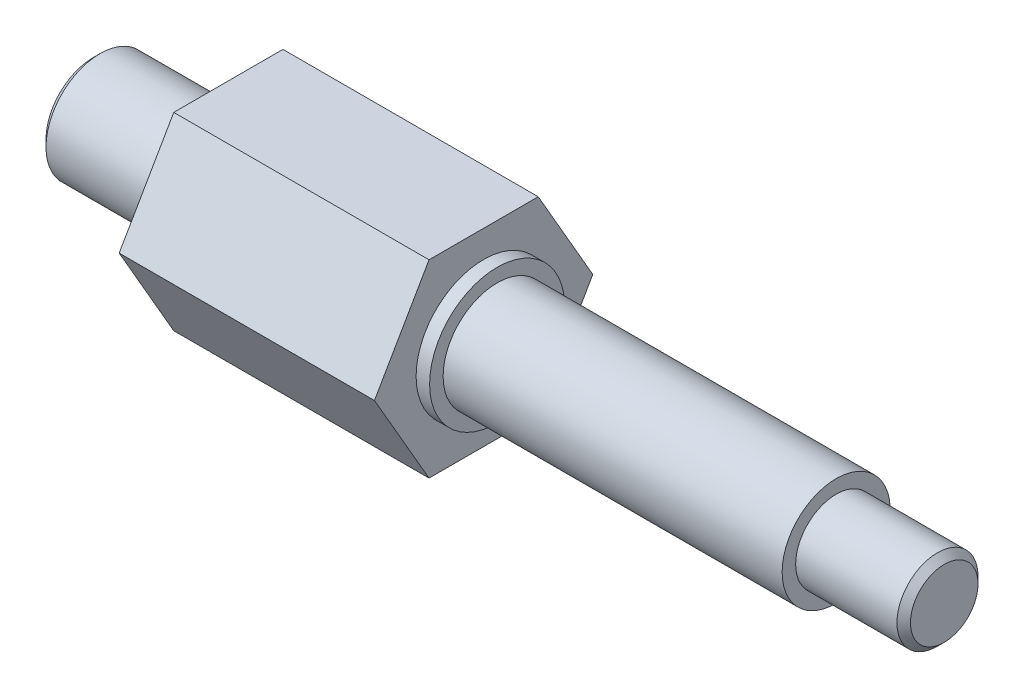
ISO-10303-21;
HEADER;
FILE_DESCRIPTION(('STEP AP214'),'2;1');
FILE_NAME('part.step','',(''),(''),'','','');
FILE_SCHEMA(('AUTOMOTIVE_DESIGN { 1 0 10303 214 1 1 1 1 }'));
ENDSEC;
DATA;
#1=APPLICATION_CONTEXT('core data for automotive mechanical design processes');
#2=APPLICATION_PROTOCOL_DEFINITION('international standard','automotive_design',2000,#1);
#3=PRODUCT_CONTEXT('',#1,'mechanical');
#4=PRODUCT('Part','Part','',(#3));
#5=PRODUCT_RELATED_PRODUCT_CATEGORY('part','',(#4));
#6=PRODUCT_DEFINITION_FORMATION('','',#4);
#7=PRODUCT_DEFINITION_CONTEXT('part definition',#1,'design');
#8=PRODUCT_DEFINITION('design','',#6,#7);
#9=PRODUCT_DEFINITION_SHAPE('','',#8);
#10=(LENGTH_UNIT() NAMED_UNIT(*) SI_UNIT(.MILLI.,.METRE.));
#11=(NAMED_UNIT(*) PLANE_ANGLE_UNIT() SI_UNIT($,.RADIAN.));
#12=(NAMED_UNIT(*) SI_UNIT($,.STERADIAN.) SOLID_ANGLE_UNIT());
#13=UNCERTAINTY_MEASURE_WITH_UNIT(LENGTH_MEASURE(1.E-05),#10,'distance_accuracy_value','');
#14=(GEOMETRIC_REPRESENTATION_CONTEXT(3) GLOBAL_UNCERTAINTY_ASSIGNED_CONTEXT((#13)) GLOBAL_UNIT_ASSIGNED_CONTEXT((#10,
#11,#12)) REPRESENTATION_CONTEXT('',''));
#15=CARTESIAN_POINT('',(0.,0.,0.));
#16=DIRECTION('',(0.,0.,1.));
#17=DIRECTION('',(1.,0.,0.));
#18=AXIS2_PLACEMENT_3D('',#15,#16,#17);
#19=CARTESIAN_POINT('',(53.,6.99999673624924,4.04145));
#20=DIRECTION('',(0.,-0.5,-0.866025403784439));
#21=DIRECTION('',(0.,0.866025403784439,-0.5));
#22=AXIS2_PLACEMENT_3D('',#19,#20,#21);
#23=PLANE('',#22);
#24=DIRECTION('',(0.,-0.866025403784439,0.5));
#25=VECTOR('',#24,1.);
#26=CARTESIAN_POINT('',(18.9,6.99999673624924,4.04145));
#27=LINE('',#26,#25);
#28=CARTESIAN_POINT('',(18.9,6.99999673624924,4.04145000000001));
#29=VERTEX_POINT('',#28);
#30=CARTESIAN_POINT('',(18.9,0.,8.08290000000001));
#31=VERTEX_POINT('',#30);
#32=EDGE_CURVE('E88',#29,#31,#27,.T.);
#33=ORIENTED_EDGE('',*,*,#32,.F.);
#34=DIRECTION('',(-1.,0.,0.));
#35=VECTOR('',#34,1.);
#36=CARTESIAN_POINT('',(53.,6.99999673624924,4.04145));
#37=LINE('',#36,#35);
#38=CARTESIAN_POINT('',(0.,6.99999673624924,4.04145));
#39=VERTEX_POINT('',#38);
#40=EDGE_CURVE('E59',#29,#39,#37,.T.);
#41=ORIENTED_EDGE('',*,*,#40,.T.);
#42=DIRECTION('',(0.,0.866025403784439,-0.5));
#43=VECTOR('',#42,1.);
#44=CARTESIAN_POINT('',(0.,6.99999673624924,4.04145));
#45=LINE('',#44,#43);
#46=CARTESIAN_POINT('',(0.,0.,8.08290000000001));
#47=VERTEX_POINT('',#46);
#48=EDGE_CURVE('E106',#47,#39,#45,.T.);
#49=ORIENTED_EDGE('',*,*,#48,.F.);
#50=DIRECTION('',(-1.,0.,0.));
#51=VECTOR('',#50,1.);
#52=CARTESIAN_POINT('',(53.,0.,8.08290000000001));
#53=LINE('',#52,#51);
#54=EDGE_CURVE('E101',#31,#47,#53,.T.);
#55=ORIENTED_EDGE('',*,*,#54,.F.);
#56=EDGE_LOOP('',(#33,#41,#49,#55));
#57=FACE_BOUND('',#56,.T.);
#58=ADVANCED_FACE('F36',(#57),#23,.F.);
#59=CARTESIAN_POINT('',(53.,0.,8.08290000000001));
#60=DIRECTION('',(0.,0.5,-0.866025403784439));
#61=DIRECTION('',(0.,0.866025403784439,0.5));
#62=AXIS2_PLACEMENT_3D('',#59,#60,#61);
#63=PLANE('',#62);
#64=DIRECTION('',(0.,-0.866025403784439,-0.5));
#65=VECTOR('',#64,1.);
#66=CARTESIAN_POINT('',(18.9,0.,8.08290000000001));
#67=LINE('',#66,#65);
#68=CARTESIAN_POINT('',(18.9,-6.99999673624924,4.04145000000001));
#69=VERTEX_POINT('',#68);
#70=EDGE_CURVE('E91',#31,#69,#67,.T.);
#71=ORIENTED_EDGE('',*,*,#70,.F.);
#72=ORIENTED_EDGE('',*,*,#54,.T.);
#73=DIRECTION('',(0.,0.866025403784439,0.5));
#74=VECTOR('',#73,1.);
#75=CARTESIAN_POINT('',(0.,0.,8.08290000000001));
#76=LINE('',#75,#74);
#77=CARTESIAN_POINT('',(0.,-6.99999673624924,4.04145000000001));
#78=VERTEX_POINT('',#77);
#79=EDGE_CURVE('E243',#78,#47,#76,.T.);
#80=ORIENTED_EDGE('',*,*,#79,.F.);
#81=DIRECTION('',(-1.,0.,0.));
#82=VECTOR('',#81,1.);
#83=CARTESIAN_POINT('',(53.,-6.99999673624924,4.04145));
#84=LINE('',#83,#82);
#85=EDGE_CURVE('E103',#69,#78,#84,.T.);
#86=ORIENTED_EDGE('',*,*,#85,.F.);
#87=EDGE_LOOP('',(#71,#72,#80,#86));
#88=FACE_BOUND('',#87,.T.);
#89=ADVANCED_FACE('F99',(#88),#63,.F.);
#90=CARTESIAN_POINT('',(53.,-6.99999673624924,4.04145));
#91=DIRECTION('',(0.,1.,0.));
#92=DIRECTION('',(0.,0.,1.));
#93=AXIS2_PLACEMENT_3D('',#90,#91,#92);
#94=PLANE('',#93);
#95=DIRECTION('',(0.,0.,-1.));
#96=VECTOR('',#95,1.);
#97=CARTESIAN_POINT('',(18.9,-6.99999673624924,4.04145));
#98=LINE('',#97,#96);
#99=CARTESIAN_POINT('',(18.9,-6.99999673624925,-4.04145));
#100=VERTEX_POINT('',#99);
#101=EDGE_CURVE('E104',#69,#100,#98,.T.);
#102=ORIENTED_EDGE('',*,*,#101,.F.);
#103=ORIENTED_EDGE('',*,*,#85,.T.);
#104=DIRECTION('',(0.,0.,1.));
#105=VECTOR('',#104,1.);
#106=CARTESIAN_POINT('',(0.,-6.99999673624924,4.04145));
#107=LINE('',#106,#105);
#108=CARTESIAN_POINT('',(0.,-6.99999673624925,-4.04145));
#109=VERTEX_POINT('',#108);
#110=EDGE_CURVE('E240',#109,#78,#107,.T.);
#111=ORIENTED_EDGE('',*,*,#110,.F.);
#112=DIRECTION('',(-1.,0.,0.));
#113=VECTOR('',#112,1.);
#114=CARTESIAN_POINT('',(53.,-6.99999673624924,-4.04145000000001));
#115=LINE('',#114,#113);
#116=EDGE_CURVE('E111',#100,#109,#115,.T.);
#117=ORIENTED_EDGE('',*,*,#116,.F.);
#118=EDGE_LOOP('',(#102,#103,#111,#117));
#119=FACE_BOUND('',#118,.T.);
#120=ADVANCED_FACE('F141',(#119),#94,.F.);
#121=CARTESIAN_POINT('',(53.,-6.99999673624924,-4.04145000000001));
#122=DIRECTION('',(0.,0.5,0.866025403784439));
#123=DIRECTION('',(0.,-0.866025403784439,0.5));
#124=AXIS2_PLACEMENT_3D('',#121,#122,#123);
#125=PLANE('',#124);
#126=DIRECTION('',(0.,0.866025403784439,-0.5));
#127=VECTOR('',#126,1.);
#128=CARTESIAN_POINT('',(18.9,-6.99999673624924,-4.04145000000001));
#129=LINE('',#128,#127);
#130=CARTESIAN_POINT('',(18.9,0.,-8.08290000000001));
#131=VERTEX_POINT('',#130);
#132=EDGE_CURVE('E223',#100,#131,#129,.T.);
#133=ORIENTED_EDGE('',*,*,#132,.F.);
#134=ORIENTED_EDGE('',*,*,#116,.T.);
#135=DIRECTION('',(0.,-0.866025403784439,0.5));
#136=VECTOR('',#135,1.);
#137=CARTESIAN_POINT('',(0.,-6.99999673624924,-4.04145000000001));
#138=LINE('',#137,#136);
#139=CARTESIAN_POINT('',(0.,0.,-8.08290000000001));
#140=VERTEX_POINT('',#139);
#141=EDGE_CURVE('E237',#140,#109,#138,.T.);
#142=ORIENTED_EDGE('',*,*,#141,.F.);
#143=DIRECTION('',(-1.,0.,0.));
#144=VECTOR('',#143,1.);
#145=CARTESIAN_POINT('',(53.,0.,-8.08290000000001));
#146=LINE('',#145,#144);
#147=EDGE_CURVE('E249',#131,#140,#146,.T.);
#148=ORIENTED_EDGE('',*,*,#147,.F.);
#149=EDGE_LOOP('',(#133,#134,#142,#148));
#150=FACE_BOUND('',#149,.T.);
#151=ADVANCED_FACE('F146',(#150),#125,.F.);
#152=CARTESIAN_POINT('',(53.,0.,-8.08290000000001));
#153=DIRECTION('',(0.,-0.5,0.866025403784439));
#154=DIRECTION('',(0.,-0.866025403784439,-0.5));
#155=AXIS2_PLACEMENT_3D('',#152,#153,#154);
#156=PLANE('',#155);
#157=DIRECTION('',(0.,0.866025403784439,0.5));
#158=VECTOR('',#157,1.);
#159=CARTESIAN_POINT('',(18.9,0.,-8.08290000000001));
#160=LINE('',#159,#158);
#161=CARTESIAN_POINT('',(18.9,6.99999673624924,-4.04145));
#162=VERTEX_POINT('',#161);
#163=EDGE_CURVE('E51',#131,#162,#160,.T.);
#164=ORIENTED_EDGE('',*,*,#163,.F.);
#165=ORIENTED_EDGE('',*,*,#147,.T.);
#166=DIRECTION('',(0.,-0.866025403784439,-0.5));
#167=VECTOR('',#166,1.);
#168=CARTESIAN_POINT('',(0.,0.,-8.08290000000001));
#169=LINE('',#168,#167);
#170=CARTESIAN_POINT('',(0.,6.99999673624925,-4.04145000000001));
#171=VERTEX_POINT('',#170);
#172=EDGE_CURVE('E234',#171,#140,#169,.T.);
#173=ORIENTED_EDGE('',*,*,#172,.F.);
#174=DIRECTION('',(-1.,0.,0.));
#175=VECTOR('',#174,1.);
#176=CARTESIAN_POINT('',(53.,6.99999673624924,-4.04145));
#177=LINE('',#176,#175);
#178=EDGE_CURVE('E247',#162,#171,#177,.T.);
#179=ORIENTED_EDGE('',*,*,#178,.F.);
#180=EDGE_LOOP('',(#164,#165,#173,#179));
#181=FACE_BOUND('',#180,.T.);
#182=ADVANCED_FACE('F150',(#181),#156,.F.);
#183=CARTESIAN_POINT('',(53.,6.99999673624924,-4.04145));
#184=DIRECTION('',(0.,-1.,0.));
#185=DIRECTION('',(0.,0.,-1.));
#186=AXIS2_PLACEMENT_3D('',#183,#184,#185);
#187=PLANE('',#186);
#188=DIRECTION('',(0.,0.,1.));
#189=VECTOR('',#188,1.);
#190=CARTESIAN_POINT('',(18.9,6.99999673624924,-4.04145));
#191=LINE('',#190,#189);
#192=EDGE_CURVE('E93',#162,#29,#191,.T.);
#193=ORIENTED_EDGE('',*,*,#192,.F.);
#194=ORIENTED_EDGE('',*,*,#178,.T.);
#195=DIRECTION('',(0.,0.,-1.));
#196=VECTOR('',#195,1.);
#197=CARTESIAN_POINT('',(0.,6.99999673624924,-4.04145));
#198=LINE('',#197,#196);
#199=EDGE_CURVE('E107',#39,#171,#198,.T.);
#200=ORIENTED_EDGE('',*,*,#199,.F.);
#201=ORIENTED_EDGE('',*,*,#40,.F.);
#202=EDGE_LOOP('',(#193,#194,#200,#201));
#203=FACE_BOUND('',#202,.T.);
#204=ADVANCED_FACE('F154',(#203),#187,.F.);
#205=CARTESIAN_POINT('',(0.,0.,-3.45));
#206=DIRECTION('',(-1.,0.,0.));
#207=DIRECTION('',(0.,0.,1.));
#208=AXIS2_PLACEMENT_3D('',#205,#206,#207);
#209=PLANE('',#208);
#210=CARTESIAN_POINT('',(0.,0.,0.));
#211=DIRECTION('',(-1.,0.,0.));
#212=DIRECTION('',(0.,0.,1.));
#213=AXIS2_PLACEMENT_3D('',#210,#211,#212);
#214=CIRCLE('',#213,3.45);
#215=CARTESIAN_POINT('',(0.,0.,3.45));
#216=VERTEX_POINT('',#215);
#217=EDGE_CURVE('E95',#216,#216,#214,.T.);
#218=ORIENTED_EDGE('',*,*,#217,.F.);
#219=EDGE_LOOP('',(#218));
#220=FACE_BOUND('',#219,.T.);
#221=ORIENTED_EDGE('',*,*,#48,.T.);
#222=ORIENTED_EDGE('',*,*,#199,.T.);
#223=ORIENTED_EDGE('',*,*,#172,.T.);
#224=ORIENTED_EDGE('',*,*,#141,.T.);
#225=ORIENTED_EDGE('',*,*,#110,.T.);
#226=ORIENTED_EDGE('',*,*,#79,.T.);
#227=EDGE_LOOP('',(#221,#222,#223,#224,#225,#226));
#228=FACE_BOUND('',#227,.T.);
#229=ADVANCED_FACE('F158',(#220,#228),#209,.T.);
#230=CARTESIAN_POINT('',(-12.6276838108398,0.,0.));
#231=DIRECTION('',(-1.,0.,0.));
#232=DIRECTION('',(0.,0.,1.));
#233=AXIS2_PLACEMENT_3D('',#230,#231,#232);
#234=CYLINDRICAL_SURFACE('',#233,4.);
#235=CARTESIAN_POINT('',(-9.5,0.,0.));
#236=DIRECTION('',(1.,0.,0.));
#237=DIRECTION('',(0.,0.,-1.));
#238=AXIS2_PLACEMENT_3D('',#235,#236,#237);
#239=CIRCLE('',#238,4.);
#240=CARTESIAN_POINT('',(-9.5,0.,-4.));
#241=VERTEX_POINT('',#240);
#242=EDGE_CURVE('E119',#241,#241,#239,.T.);
#243=ORIENTED_EDGE('',*,*,#242,.T.);
#244=EDGE_LOOP('',(#243));
#245=FACE_BOUND('',#244,.T.);
#246=CARTESIAN_POINT('',(-0.999999999999999,0.,0.));
#247=DIRECTION('',(-1.,0.,0.));
#248=DIRECTION('',(0.,0.,1.));
#249=AXIS2_PLACEMENT_3D('',#246,#247,#248);
#250=CIRCLE('',#249,4.);
#251=CARTESIAN_POINT('',(-0.999999999999999,0.,4.));
#252=VERTEX_POINT('',#251);
#253=EDGE_CURVE('E231',#252,#252,#250,.T.);
#254=ORIENTED_EDGE('',*,*,#253,.T.);
#255=EDGE_LOOP('',(#254));
#256=FACE_BOUND('',#255,.T.);
#257=ADVANCED_FACE('F169',(#245,#256),#234,.T.);
#258=CARTESIAN_POINT('',(-1.,0.,-4.));
#259=DIRECTION('',(1.,0.,0.));
#260=DIRECTION('',(0.,0.,-1.));
#261=AXIS2_PLACEMENT_3D('',#258,#259,#260);
#262=PLANE('',#261);
#263=CARTESIAN_POINT('',(-1.,0.,0.));
#264=DIRECTION('',(-1.,0.,0.));
#265=DIRECTION('',(0.,0.,1.));
#266=AXIS2_PLACEMENT_3D('',#263,#264,#265);
#267=CIRCLE('',#266,3.45);
#268=CARTESIAN_POINT('',(-1.,0.,3.45));
#269=VERTEX_POINT('',#268);
#270=EDGE_CURVE('E228',#269,#269,#267,.T.);
#271=ORIENTED_EDGE('',*,*,#270,.T.);
#272=EDGE_LOOP('',(#271));
#273=FACE_BOUND('',#272,.T.);
#274=ORIENTED_EDGE('',*,*,#253,.F.);
#275=EDGE_LOOP('',(#274));
#276=FACE_BOUND('',#275,.T.);
#277=ADVANCED_FACE('F172',(#273,#276),#262,.T.);
#278=CARTESIAN_POINT('',(-12.6276838108398,0.,0.));
#279=DIRECTION('',(-1.,0.,0.));
#280=DIRECTION('',(0.,0.,1.));
#281=AXIS2_PLACEMENT_3D('',#278,#279,#280);
#282=CYLINDRICAL_SURFACE('',#281,3.45);
#283=ORIENTED_EDGE('',*,*,#217,.T.);
#284=EDGE_LOOP('',(#283));
#285=FACE_BOUND('',#284,.T.);
#286=ORIENTED_EDGE('',*,*,#270,.F.);
#287=EDGE_LOOP('',(#286));
#288=FACE_BOUND('',#287,.T.);
#289=ADVANCED_FACE('F163',(#285,#288),#282,.T.);
#290=CARTESIAN_POINT('',(-10.,0.,8.08290000000001));
#291=DIRECTION('',(1.,0.,0.));
#292=DIRECTION('',(0.,0.,-1.));
#293=AXIS2_PLACEMENT_3D('',#290,#291,#292);
#294=PLANE('',#293);
#295=CARTESIAN_POINT('',(-10.,0.,0.));
#296=DIRECTION('',(1.,0.,0.));
#297=DIRECTION('',(0.,0.,-1.));
#298=AXIS2_PLACEMENT_3D('',#295,#296,#297);
#299=CIRCLE('',#298,3.5);
#300=CARTESIAN_POINT('',(-10.,0.,-3.5));
#301=VERTEX_POINT('',#300);
#302=EDGE_CURVE('E116',#301,#301,#299,.F.);
#303=ORIENTED_EDGE('',*,*,#302,.T.);
#304=EDGE_LOOP('',(#303));
#305=FACE_BOUND('',#304,.T.);
#306=ADVANCED_FACE('F160',(#305),#294,.F.);
#307=CARTESIAN_POINT('',(18.9,0.,-5.));
#308=DIRECTION('',(1.,0.,0.));
#309=DIRECTION('',(0.,0.,-1.));
#310=AXIS2_PLACEMENT_3D('',#307,#308,#309);
#311=PLANE('',#310);
#312=CARTESIAN_POINT('',(18.9,0.,0.));
#313=DIRECTION('',(-1.,0.,0.));
#314=DIRECTION('',(0.,0.,1.));
#315=AXIS2_PLACEMENT_3D('',#312,#313,#314);
#316=CIRCLE('',#315,5.);
#317=CARTESIAN_POINT('',(18.9,0.,5.));
#318=VERTEX_POINT('',#317);
#319=EDGE_CURVE('E206',#318,#318,#316,.T.);
#320=ORIENTED_EDGE('',*,*,#319,.T.);
#321=EDGE_LOOP('',(#320));
#322=FACE_BOUND('',#321,.T.);
#323=ORIENTED_EDGE('',*,*,#32,.T.);
#324=ORIENTED_EDGE('',*,*,#70,.T.);
#325=ORIENTED_EDGE('',*,*,#101,.T.);
#326=ORIENTED_EDGE('',*,*,#132,.T.);
#327=ORIENTED_EDGE('',*,*,#163,.T.);
#328=ORIENTED_EDGE('',*,*,#192,.T.);
#329=EDGE_LOOP('',(#323,#324,#325,#326,#327,#328));
#330=FACE_BOUND('',#329,.T.);
#331=ADVANCED_FACE('F90',(#322,#330),#311,.T.);
#332=CARTESIAN_POINT('',(-14.2461728904477,0.,0.));
#333=DIRECTION('',(-1.,0.,0.));
#334=DIRECTION('',(0.,0.,1.));
#335=AXIS2_PLACEMENT_3D('',#332,#333,#334);
#336=CYLINDRICAL_SURFACE('',#335,3.);
#337=CARTESIAN_POINT('',(52.5,0.,0.));
#338=DIRECTION('',(1.,0.,0.));
#339=DIRECTION('',(0.,0.,-1.));
#340=AXIS2_PLACEMENT_3D('',#337,#338,#339);
#341=CIRCLE('',#340,3.);
#342=CARTESIAN_POINT('',(52.5,0.,-3.));
#343=VERTEX_POINT('',#342);
#344=EDGE_CURVE('E44',#343,#343,#341,.F.);
#345=ORIENTED_EDGE('',*,*,#344,.T.);
#346=EDGE_LOOP('',(#345));
#347=FACE_BOUND('',#346,.T.);
#348=CARTESIAN_POINT('',(45.,0.,0.));
#349=DIRECTION('',(-1.,0.,0.));
#350=DIRECTION('',(0.,0.,1.));
#351=AXIS2_PLACEMENT_3D('',#348,#349,#350);
#352=CIRCLE('',#351,3.);
#353=CARTESIAN_POINT('',(45.,0.,3.));
#354=VERTEX_POINT('',#353);
#355=EDGE_CURVE('E219',#354,#354,#352,.T.);
#356=ORIENTED_EDGE('',*,*,#355,.F.);
#357=EDGE_LOOP('',(#356));
#358=FACE_BOUND('',#357,.T.);
#359=ADVANCED_FACE('F124',(#347,#358),#336,.T.);
#360=CARTESIAN_POINT('',(45.,0.,-3.));
#361=DIRECTION('',(1.,0.,0.));
#362=DIRECTION('',(0.,0.,-1.));
#363=AXIS2_PLACEMENT_3D('',#360,#361,#362);
#364=PLANE('',#363);
#365=ORIENTED_EDGE('',*,*,#355,.T.);
#366=EDGE_LOOP('',(#365));
#367=FACE_BOUND('',#366,.T.);
#368=CARTESIAN_POINT('',(45.,0.,0.));
#369=DIRECTION('',(-1.,0.,0.));
#370=DIRECTION('',(0.,0.,1.));
#371=AXIS2_PLACEMENT_3D('',#368,#369,#370);
#372=CIRCLE('',#371,4.);
#373=CARTESIAN_POINT('',(45.,0.,4.));
#374=VERTEX_POINT('',#373);
#375=EDGE_CURVE('E216',#374,#374,#372,.T.);
#376=ORIENTED_EDGE('',*,*,#375,.F.);
#377=EDGE_LOOP('',(#376));
#378=FACE_BOUND('',#377,.T.);
#379=ADVANCED_FACE('F185',(#367,#378),#364,.T.);
#380=CARTESIAN_POINT('',(-14.2461728904477,0.,0.));
#381=DIRECTION('',(-1.,0.,0.));
#382=DIRECTION('',(0.,0.,1.));
#383=AXIS2_PLACEMENT_3D('',#380,#381,#382);
#384=CYLINDRICAL_SURFACE('',#383,4.);
#385=ORIENTED_EDGE('',*,*,#375,.T.);
#386=EDGE_LOOP('',(#385));
#387=FACE_BOUND('',#386,.T.);
#388=CARTESIAN_POINT('',(19.9,0.,0.));
#389=DIRECTION('',(-1.,0.,0.));
#390=DIRECTION('',(0.,0.,1.));
#391=AXIS2_PLACEMENT_3D('',#388,#389,#390);
#392=CIRCLE('',#391,4.);
#393=CARTESIAN_POINT('',(19.9,0.,4.));
#394=VERTEX_POINT('',#393);
#395=EDGE_CURVE('E211',#394,#394,#392,.T.);
#396=ORIENTED_EDGE('',*,*,#395,.F.);
#397=EDGE_LOOP('',(#396));
#398=FACE_BOUND('',#397,.T.);
#399=ADVANCED_FACE('F188',(#387,#398),#384,.T.);
#400=CARTESIAN_POINT('',(19.9,0.,-4.));
#401=DIRECTION('',(1.,0.,0.));
#402=DIRECTION('',(0.,0.,-1.));
#403=AXIS2_PLACEMENT_3D('',#400,#401,#402);
#404=PLANE('',#403);
#405=ORIENTED_EDGE('',*,*,#395,.T.);
#406=EDGE_LOOP('',(#405));
#407=FACE_BOUND('',#406,.T.);
#408=CARTESIAN_POINT('',(19.9,0.,0.));
#409=DIRECTION('',(-1.,0.,0.));
#410=DIRECTION('',(0.,0.,1.));
#411=AXIS2_PLACEMENT_3D('',#408,#409,#410);
#412=CIRCLE('',#411,5.);
#413=CARTESIAN_POINT('',(19.9,0.,5.));
#414=VERTEX_POINT('',#413);
#415=EDGE_CURVE('E208',#414,#414,#412,.T.);
#416=ORIENTED_EDGE('',*,*,#415,.F.);
#417=EDGE_LOOP('',(#416));
#418=FACE_BOUND('',#417,.T.);
#419=ADVANCED_FACE('F192',(#407,#418),#404,.T.);
#420=CARTESIAN_POINT('',(-14.2461728904477,0.,0.));
#421=DIRECTION('',(-1.,0.,0.));
#422=DIRECTION('',(0.,0.,1.));
#423=AXIS2_PLACEMENT_3D('',#420,#421,#422);
#424=CYLINDRICAL_SURFACE('',#423,5.);
#425=ORIENTED_EDGE('',*,*,#415,.T.);
#426=EDGE_LOOP('',(#425));
#427=FACE_BOUND('',#426,.T.);
#428=ORIENTED_EDGE('',*,*,#319,.F.);
#429=EDGE_LOOP('',(#428));
#430=FACE_BOUND('',#429,.T.);
#431=ADVANCED_FACE('F167',(#427,#430),#424,.T.);
#432=CARTESIAN_POINT('',(53.,0.,8.08290000000001));
#433=DIRECTION('',(1.,0.,0.));
#434=DIRECTION('',(0.,0.,-1.));
#435=AXIS2_PLACEMENT_3D('',#432,#433,#434);
#436=PLANE('',#435);
#437=CARTESIAN_POINT('',(53.,0.,0.));
#438=DIRECTION('',(1.,0.,0.));
#439=DIRECTION('',(0.,0.,-1.));
#440=AXIS2_PLACEMENT_3D('',#437,#438,#439);
#441=CIRCLE('',#440,2.50000000000002);
#442=CARTESIAN_POINT('',(53.,0.,-2.50000000000002));
#443=VERTEX_POINT('',#442);
#444=EDGE_CURVE('E11',#443,#443,#441,.T.);
#445=ORIENTED_EDGE('',*,*,#444,.T.);
#446=EDGE_LOOP('',(#445));
#447=FACE_BOUND('',#446,.T.);
#448=ADVANCED_FACE('F133',(#447),#436,.T.);
#449=CARTESIAN_POINT('',(-10.,0.,0.));
#450=DIRECTION('',(1.,0.,0.));
#451=DIRECTION('',(0.,0.,-1.));
#452=AXIS2_PLACEMENT_3D('',#449,#450,#451);
#453=CONICAL_SURFACE('',#452,3.5,0.785398163397452);
#454=ORIENTED_EDGE('',*,*,#242,.F.);
#455=EDGE_LOOP('',(#454));
#456=FACE_BOUND('',#455,.T.);
#457=ORIENTED_EDGE('',*,*,#302,.F.);
#458=EDGE_LOOP('',(#457));
#459=FACE_BOUND('',#458,.T.);
#460=ADVANCED_FACE('F128',(#456,#459),#453,.T.);
#461=CARTESIAN_POINT('',(52.5,0.,0.));
#462=DIRECTION('',(-1.,0.,0.));
#463=DIRECTION('',(0.,0.,1.));
#464=AXIS2_PLACEMENT_3D('',#461,#462,#463);
#465=CONICAL_SURFACE('',#464,3.,0.785398163397439);
#466=ORIENTED_EDGE('',*,*,#444,.F.);
#467=EDGE_LOOP('',(#466));
#468=FACE_BOUND('',#467,.T.);
#469=ORIENTED_EDGE('',*,*,#344,.F.);
#470=EDGE_LOOP('',(#469));
#471=FACE_BOUND('',#470,.T.);
#472=ADVANCED_FACE('F38',(#468,#471),#465,.T.);
#473=CLOSED_SHELL('',(#58,#89,#120,#151,#182,#204,#229,#257,#277,#289,#306,#331,#359,#379,#399,
#419,#431,#448,#460,#472));
#474=MANIFOLD_SOLID_BREP('B2',#473);
#475=ADVANCED_BREP_SHAPE_REPRESENTATION('',(#18,#474),#14);
#476=SHAPE_DEFINITION_REPRESENTATION(#9,#475);
ENDSEC;
END-ISO-10303-21;
